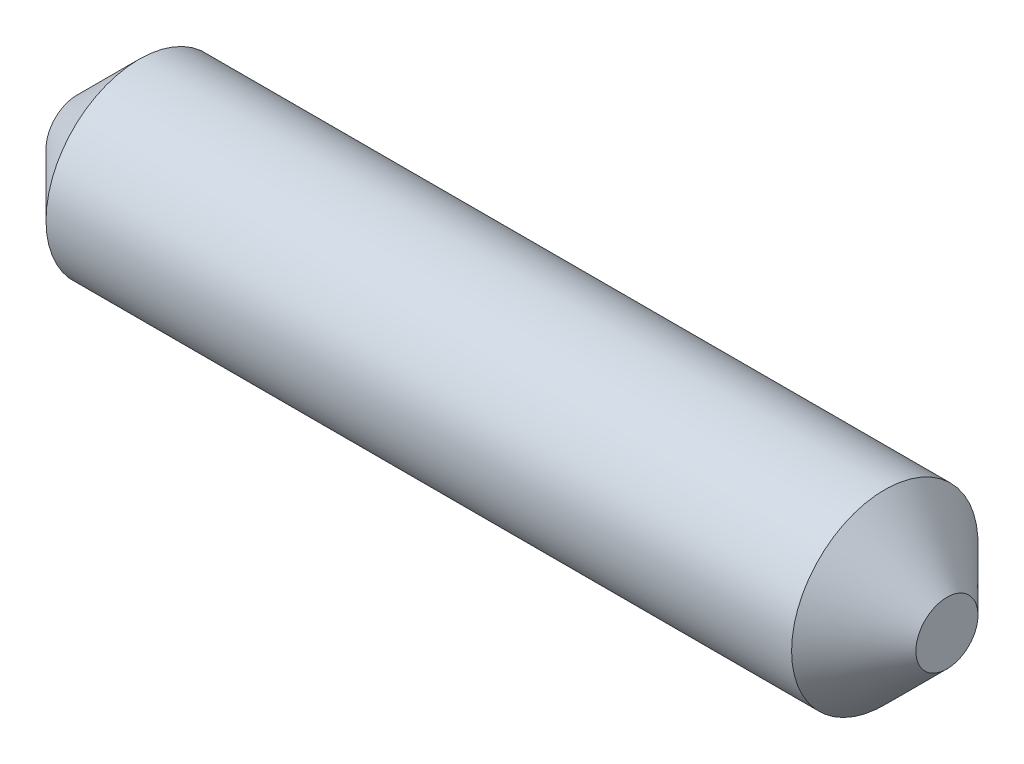
ISO-10303-21;
HEADER;
FILE_DESCRIPTION(('STEP AP214'),'2;1');
FILE_NAME('part.step','',(''),(''),'','','');
FILE_SCHEMA(('AUTOMOTIVE_DESIGN { 1 0 10303 214 1 1 1 1 }'));
ENDSEC;
DATA;
#1=APPLICATION_CONTEXT('core data for automotive mechanical design processes');
#2=APPLICATION_PROTOCOL_DEFINITION('international standard','automotive_design',2000,#1);
#3=PRODUCT_CONTEXT('',#1,'mechanical');
#4=PRODUCT('Part','Part','',(#3));
#5=PRODUCT_RELATED_PRODUCT_CATEGORY('part','',(#4));
#6=PRODUCT_DEFINITION_FORMATION('','',#4);
#7=PRODUCT_DEFINITION_CONTEXT('part definition',#1,'design');
#8=PRODUCT_DEFINITION('design','',#6,#7);
#9=PRODUCT_DEFINITION_SHAPE('','',#8);
#10=(LENGTH_UNIT() NAMED_UNIT(*) SI_UNIT(.MILLI.,.METRE.));
#11=(NAMED_UNIT(*) PLANE_ANGLE_UNIT() SI_UNIT($,.RADIAN.));
#12=(NAMED_UNIT(*) SI_UNIT($,.STERADIAN.) SOLID_ANGLE_UNIT());
#13=UNCERTAINTY_MEASURE_WITH_UNIT(LENGTH_MEASURE(1.E-05),#10,'distance_accuracy_value','');
#14=(GEOMETRIC_REPRESENTATION_CONTEXT(3) GLOBAL_UNCERTAINTY_ASSIGNED_CONTEXT((#13)) GLOBAL_UNIT_ASSIGNED_CONTEXT((#10,
#11,#12)) REPRESENTATION_CONTEXT('',''));
#15=CARTESIAN_POINT('',(0.,0.,0.));
#16=DIRECTION('',(0.,0.,1.));
#17=DIRECTION('',(1.,0.,0.));
#18=AXIS2_PLACEMENT_3D('',#15,#16,#17);
#19=CARTESIAN_POINT('',(7.,0.,0.));
#20=DIRECTION('',(-1.,0.,0.));
#21=DIRECTION('',(0.,0.,1.));
#22=AXIS2_PLACEMENT_3D('',#19,#20,#21);
#23=CYLINDRICAL_SURFACE('',#22,1.5);
#24=CARTESIAN_POINT('',(-6.,0.,0.));
#25=DIRECTION('',(1.,0.,0.));
#26=DIRECTION('',(0.,0.,-1.));
#27=AXIS2_PLACEMENT_3D('',#24,#25,#26);
#28=CIRCLE('',#27,1.5);
#29=CARTESIAN_POINT('',(-6.00000000000001,0.,-1.5));
#30=VERTEX_POINT('',#29);
#31=EDGE_CURVE('E42',#30,#30,#28,.T.);
#32=ORIENTED_EDGE('',*,*,#31,.T.);
#33=EDGE_LOOP('',(#32));
#34=FACE_BOUND('',#33,.T.);
#35=CARTESIAN_POINT('',(5.99999999999999,0.,0.));
#36=DIRECTION('',(1.,0.,0.));
#37=DIRECTION('',(0.,0.,-1.));
#38=AXIS2_PLACEMENT_3D('',#35,#36,#37);
#39=CIRCLE('',#38,1.5);
#40=CARTESIAN_POINT('',(5.99999999999999,0.,1.5));
#41=VERTEX_POINT('',#40);
#42=EDGE_CURVE('E46',#41,#41,#39,.F.);
#43=ORIENTED_EDGE('',*,*,#42,.T.);
#44=EDGE_LOOP('',(#43));
#45=FACE_BOUND('',#44,.T.);
#46=ADVANCED_FACE('F31',(#34,#45),#23,.T.);
#47=CARTESIAN_POINT('',(7.,0.,0.));
#48=DIRECTION('',(1.,0.,0.));
#49=DIRECTION('',(0.,0.,-1.));
#50=AXIS2_PLACEMENT_3D('',#47,#48,#49);
#51=PLANE('',#50);
#52=CARTESIAN_POINT('',(7.,0.,0.));
#53=DIRECTION('',(1.,0.,0.));
#54=DIRECTION('',(0.,0.,-1.));
#55=AXIS2_PLACEMENT_3D('',#52,#53,#54);
#56=CIRCLE('',#55,0.499999999999997);
#57=CARTESIAN_POINT('',(7.,0.,0.499999999999997));
#58=VERTEX_POINT('',#57);
#59=EDGE_CURVE('E10',#58,#58,#56,.T.);
#60=ORIENTED_EDGE('',*,*,#59,.T.);
#61=EDGE_LOOP('',(#60));
#62=FACE_BOUND('',#61,.T.);
#63=ADVANCED_FACE('F62',(#62),#51,.T.);
#64=CARTESIAN_POINT('',(-7.,0.,0.));
#65=DIRECTION('',(1.,0.,0.));
#66=DIRECTION('',(0.,0.,-1.));
#67=AXIS2_PLACEMENT_3D('',#64,#65,#66);
#68=PLANE('',#67);
#69=CARTESIAN_POINT('',(-7.,0.,0.));
#70=DIRECTION('',(1.,0.,0.));
#71=DIRECTION('',(0.,0.,-1.));
#72=AXIS2_PLACEMENT_3D('',#69,#70,#71);
#73=CIRCLE('',#72,0.5);
#74=CARTESIAN_POINT('',(-7.,0.,-0.5));
#75=VERTEX_POINT('',#74);
#76=EDGE_CURVE('E38',#75,#75,#73,.F.);
#77=ORIENTED_EDGE('',*,*,#76,.T.);
#78=EDGE_LOOP('',(#77));
#79=FACE_BOUND('',#78,.T.);
#80=ADVANCED_FACE('F59',(#79),#68,.F.);
#81=CARTESIAN_POINT('',(-6.,0.,0.));
#82=DIRECTION('',(1.,0.,0.));
#83=DIRECTION('',(0.,0.,-1.));
#84=AXIS2_PLACEMENT_3D('',#81,#82,#83);
#85=CONICAL_SURFACE('',#84,1.5,0.78539816339745);
#86=CARTESIAN_POINT('',(-7.,0.,-0.5));
#87=CARTESIAN_POINT('',(-6.98958333333333,0.,-0.510416666666667));
#88=CARTESIAN_POINT('',(-6.97916666666667,0.,-0.520833333333333));
#89=CARTESIAN_POINT('',(-6.95833333333333,0.,-0.541666666666667));
#90=CARTESIAN_POINT('',(-6.94791666666667,0.,-0.552083333333333));
#91=CARTESIAN_POINT('',(-6.92708333333333,0.,-0.572916666666667));
#92=CARTESIAN_POINT('',(-6.91666666666667,0.,-0.583333333333333));
#93=CARTESIAN_POINT('',(-6.89583333333333,0.,-0.604166666666667));
#94=CARTESIAN_POINT('',(-6.88541666666667,0.,-0.614583333333333));
#95=CARTESIAN_POINT('',(-6.86458333333333,0.,-0.635416666666666));
#96=CARTESIAN_POINT('',(-6.85416666666667,0.,-0.645833333333333));
#97=CARTESIAN_POINT('',(-6.83333333333333,0.,-0.666666666666666));
#98=CARTESIAN_POINT('',(-6.82291666666667,0.,-0.677083333333333));
#99=CARTESIAN_POINT('',(-6.80208333333334,0.,-0.697916666666667));
#100=CARTESIAN_POINT('',(-6.79166666666667,0.,-0.708333333333333));
#101=CARTESIAN_POINT('',(-6.77083333333334,0.,-0.729166666666666));
#102=CARTESIAN_POINT('',(-6.76041666666667,0.,-0.739583333333333));
#103=CARTESIAN_POINT('',(-6.73958333333334,0.,-0.760416666666666));
#104=CARTESIAN_POINT('',(-6.72916666666667,0.,-0.770833333333333));
#105=CARTESIAN_POINT('',(-6.70833333333333,0.,-0.791666666666666));
#106=CARTESIAN_POINT('',(-6.69791666666667,0.,-0.802083333333333));
#107=CARTESIAN_POINT('',(-6.67708333333333,0.,-0.822916666666666));
#108=CARTESIAN_POINT('',(-6.66666666666667,0.,-0.833333333333333));
#109=CARTESIAN_POINT('',(-6.64583333333334,0.,-0.854166666666667));
#110=CARTESIAN_POINT('',(-6.63541666666667,0.,-0.864583333333333));
#111=CARTESIAN_POINT('',(-6.61458333333334,0.,-0.885416666666666));
#112=CARTESIAN_POINT('',(-6.60416666666667,0.,-0.895833333333333));
#113=CARTESIAN_POINT('',(-6.58333333333334,0.,-0.916666666666666));
#114=CARTESIAN_POINT('',(-6.57291666666667,0.,-0.927083333333333));
#115=CARTESIAN_POINT('',(-6.55208333333334,0.,-0.947916666666666));
#116=CARTESIAN_POINT('',(-6.54166666666667,0.,-0.958333333333333));
#117=CARTESIAN_POINT('',(-6.52083333333334,0.,-0.979166666666666));
#118=CARTESIAN_POINT('',(-6.51041666666667,0.,-0.989583333333333));
#119=CARTESIAN_POINT('',(-6.48958333333334,0.,-1.01041666666667));
#120=CARTESIAN_POINT('',(-6.47916666666667,0.,-1.02083333333333));
#121=CARTESIAN_POINT('',(-6.45833333333334,0.,-1.04166666666667));
#122=CARTESIAN_POINT('',(-6.44791666666667,0.,-1.05208333333333));
#123=CARTESIAN_POINT('',(-6.42708333333334,0.,-1.07291666666667));
#124=CARTESIAN_POINT('',(-6.41666666666667,0.,-1.08333333333333));
#125=CARTESIAN_POINT('',(-6.39583333333334,0.,-1.10416666666667));
#126=CARTESIAN_POINT('',(-6.38541666666667,0.,-1.11458333333333));
#127=CARTESIAN_POINT('',(-6.36458333333334,0.,-1.13541666666667));
#128=CARTESIAN_POINT('',(-6.35416666666667,0.,-1.14583333333333));
#129=CARTESIAN_POINT('',(-6.33333333333334,0.,-1.16666666666667));
#130=CARTESIAN_POINT('',(-6.32291666666667,0.,-1.17708333333333));
#131=CARTESIAN_POINT('',(-6.30208333333334,0.,-1.19791666666667));
#132=CARTESIAN_POINT('',(-6.29166666666667,0.,-1.20833333333333));
#133=CARTESIAN_POINT('',(-6.27083333333334,0.,-1.22916666666667));
#134=CARTESIAN_POINT('',(-6.26041666666667,0.,-1.23958333333333));
#135=CARTESIAN_POINT('',(-6.23958333333334,0.,-1.26041666666667));
#136=CARTESIAN_POINT('',(-6.22916666666667,0.,-1.27083333333333));
#137=CARTESIAN_POINT('',(-6.20833333333334,0.,-1.29166666666667));
#138=CARTESIAN_POINT('',(-6.19791666666667,0.,-1.30208333333333));
#139=CARTESIAN_POINT('',(-6.17708333333334,0.,-1.32291666666667));
#140=CARTESIAN_POINT('',(-6.16666666666667,0.,-1.33333333333333));
#141=CARTESIAN_POINT('',(-6.14583333333334,0.,-1.35416666666667));
#142=CARTESIAN_POINT('',(-6.13541666666667,0.,-1.36458333333333));
#143=CARTESIAN_POINT('',(-6.11458333333334,0.,-1.38541666666667));
#144=CARTESIAN_POINT('',(-6.10416666666667,0.,-1.39583333333333));
#145=CARTESIAN_POINT('',(-6.08333333333334,0.,-1.41666666666667));
#146=CARTESIAN_POINT('',(-6.07291666666667,0.,-1.42708333333333));
#147=CARTESIAN_POINT('',(-6.05208333333334,0.,-1.44791666666667));
#148=CARTESIAN_POINT('',(-6.04166666666667,0.,-1.45833333333333));
#149=CARTESIAN_POINT('',(-6.02083333333334,0.,-1.47916666666667));
#150=CARTESIAN_POINT('',(-6.01041666666667,0.,-1.48958333333333));
#151=CARTESIAN_POINT('',(-6.00000000000001,0.,-1.5));
#152=B_SPLINE_CURVE_WITH_KNOTS('',3,(#86,#87,#88,#89,#90,#91,#92,#93,#94,#95,#96,#97,#98,#99,
#100,#101,#102,#103,#104,#105,#106,#107,#108,#109,#110,#111,#112,#113,#114,#115,#116,#117,#118,
#119,#120,#121,#122,#123,#124,#125,#126,#127,#128,#129,#130,#131,#132,#133,#134,#135,#136,#137,
#138,#139,#140,#141,#142,#143,#144,#145,#146,#147,#148,#149,#150,#151),.UNSPECIFIED.,.F.,.F.,(4,
2,2,2,2,2,2,2,2,2,2,2,2,2,2,2,2,2,2,2,2,2,2,2,2,2,2,2,2,2,2,2,4),(0.,0.0441941738241591,
0.0883883476483184,0.132582521472478,0.176776695296637,0.220970869120796,0.265165042944955,
0.309359216769114,0.353553390593273,0.397747564417432,0.441941738241591,0.48613591206575,
0.530330085889909,0.574524259714069,0.618718433538228,0.662912607362387,0.707106781186546,
0.751300955010705,0.795495128834864,0.839689302659023,0.883883476483183,0.928077650307341,
0.9722718241315,1.01646599795566,1.06066017177982,1.10485434560398,1.14904851942814,
1.1932426932523,1.23743686707646,1.28163104090061,1.32582521472477,1.37001938854893,
1.41421356237309),.UNSPECIFIED.);
#153=EDGE_CURVE('BSEAM55',#75,#30,#152,.T.);
#154=ORIENTED_EDGE('',*,*,#76,.F.);
#155=ORIENTED_EDGE('',*,*,#31,.F.);
#156=ORIENTED_EDGE('',*,*,#153,.T.);
#157=ORIENTED_EDGE('',*,*,#153,.F.);
#158=EDGE_LOOP('',(#154,#156,#155,#157));
#159=FACE_BOUND('',#158,.T.);
#160=ADVANCED_FACE('F55',(#159),#85,.T.);
#161=CARTESIAN_POINT('',(7.,0.,0.));
#162=DIRECTION('',(-1.,0.,0.));
#163=DIRECTION('',(0.,0.,1.));
#164=AXIS2_PLACEMENT_3D('',#161,#162,#163);
#165=CONICAL_SURFACE('',#164,0.499999999999997,0.785398163397447);
#166=CARTESIAN_POINT('',(5.99999999999999,0.,1.5));
#167=CARTESIAN_POINT('',(6.01041666666666,0.,1.48958333333333));
#168=CARTESIAN_POINT('',(6.02083333333333,0.,1.47916666666667));
#169=CARTESIAN_POINT('',(6.04166666666666,0.,1.45833333333333));
#170=CARTESIAN_POINT('',(6.05208333333333,0.,1.44791666666667));
#171=CARTESIAN_POINT('',(6.07291666666666,0.,1.42708333333333));
#172=CARTESIAN_POINT('',(6.08333333333333,0.,1.41666666666667));
#173=CARTESIAN_POINT('',(6.10416666666666,0.,1.39583333333333));
#174=CARTESIAN_POINT('',(6.11458333333333,0.,1.38541666666667));
#175=CARTESIAN_POINT('',(6.13541666666666,0.,1.36458333333333));
#176=CARTESIAN_POINT('',(6.14583333333333,0.,1.35416666666667));
#177=CARTESIAN_POINT('',(6.16666666666666,0.,1.33333333333333));
#178=CARTESIAN_POINT('',(6.17708333333333,0.,1.32291666666667));
#179=CARTESIAN_POINT('',(6.19791666666666,0.,1.30208333333333));
#180=CARTESIAN_POINT('',(6.20833333333333,0.,1.29166666666667));
#181=CARTESIAN_POINT('',(6.22916666666666,0.,1.27083333333333));
#182=CARTESIAN_POINT('',(6.23958333333333,0.,1.26041666666667));
#183=CARTESIAN_POINT('',(6.26041666666666,0.,1.23958333333333));
#184=CARTESIAN_POINT('',(6.27083333333333,0.,1.22916666666667));
#185=CARTESIAN_POINT('',(6.29166666666666,0.,1.20833333333333));
#186=CARTESIAN_POINT('',(6.30208333333333,0.,1.19791666666667));
#187=CARTESIAN_POINT('',(6.32291666666666,0.,1.17708333333333));
#188=CARTESIAN_POINT('',(6.33333333333333,0.,1.16666666666667));
#189=CARTESIAN_POINT('',(6.35416666666666,0.,1.14583333333333));
#190=CARTESIAN_POINT('',(6.36458333333333,0.,1.13541666666667));
#191=CARTESIAN_POINT('',(6.38541666666666,0.,1.11458333333333));
#192=CARTESIAN_POINT('',(6.39583333333333,0.,1.10416666666667));
#193=CARTESIAN_POINT('',(6.41666666666666,0.,1.08333333333333));
#194=CARTESIAN_POINT('',(6.42708333333333,0.,1.07291666666667));
#195=CARTESIAN_POINT('',(6.44791666666666,0.,1.05208333333333));
#196=CARTESIAN_POINT('',(6.45833333333333,0.,1.04166666666667));
#197=CARTESIAN_POINT('',(6.47916666666666,0.,1.02083333333333));
#198=CARTESIAN_POINT('',(6.48958333333333,0.,1.01041666666667));
#199=CARTESIAN_POINT('',(6.51041666666666,0.,0.989583333333332));
#200=CARTESIAN_POINT('',(6.52083333333333,0.,0.979166666666665));
#201=CARTESIAN_POINT('',(6.54166666666666,0.,0.958333333333332));
#202=CARTESIAN_POINT('',(6.55208333333333,0.,0.947916666666665));
#203=CARTESIAN_POINT('',(6.57291666666666,0.,0.927083333333332));
#204=CARTESIAN_POINT('',(6.58333333333333,0.,0.916666666666665));
#205=CARTESIAN_POINT('',(6.60416666666666,0.,0.895833333333332));
#206=CARTESIAN_POINT('',(6.61458333333333,0.,0.885416666666665));
#207=CARTESIAN_POINT('',(6.63541666666666,0.,0.864583333333332));
#208=CARTESIAN_POINT('',(6.64583333333333,0.,0.854166666666665));
#209=CARTESIAN_POINT('',(6.66666666666666,0.,0.833333333333332));
#210=CARTESIAN_POINT('',(6.67708333333333,0.,0.822916666666665));
#211=CARTESIAN_POINT('',(6.69791666666666,0.,0.802083333333332));
#212=CARTESIAN_POINT('',(6.70833333333333,0.,0.791666666666665));
#213=CARTESIAN_POINT('',(6.72916666666666,0.,0.770833333333331));
#214=CARTESIAN_POINT('',(6.73958333333333,0.,0.760416666666665));
#215=CARTESIAN_POINT('',(6.76041666666666,0.,0.739583333333331));
#216=CARTESIAN_POINT('',(6.77083333333333,0.,0.729166666666665));
#217=CARTESIAN_POINT('',(6.79166666666666,0.,0.708333333333331));
#218=CARTESIAN_POINT('',(6.80208333333333,0.,0.697916666666665));
#219=CARTESIAN_POINT('',(6.82291666666667,0.,0.677083333333331));
#220=CARTESIAN_POINT('',(6.83333333333333,0.,0.666666666666665));
#221=CARTESIAN_POINT('',(6.85416666666667,0.,0.645833333333331));
#222=CARTESIAN_POINT('',(6.86458333333333,0.,0.635416666666664));
#223=CARTESIAN_POINT('',(6.88541666666667,0.,0.614583333333331));
#224=CARTESIAN_POINT('',(6.89583333333333,0.,0.604166666666664));
#225=CARTESIAN_POINT('',(6.91666666666667,0.,0.583333333333331));
#226=CARTESIAN_POINT('',(6.92708333333333,0.,0.572916666666664));
#227=CARTESIAN_POINT('',(6.94791666666667,0.,0.552083333333331));
#228=CARTESIAN_POINT('',(6.95833333333333,0.,0.541666666666664));
#229=CARTESIAN_POINT('',(6.97916666666667,0.,0.520833333333331));
#230=CARTESIAN_POINT('',(6.98958333333333,0.,0.510416666666664));
#231=CARTESIAN_POINT('',(7.,0.,0.499999999999997));
#232=B_SPLINE_CURVE_WITH_KNOTS('',3,(#166,#167,#168,#169,#170,#171,#172,#173,#174,#175,#176,
#177,#178,#179,#180,#181,#182,#183,#184,#185,#186,#187,#188,#189,#190,#191,#192,#193,#194,#195,
#196,#197,#198,#199,#200,#201,#202,#203,#204,#205,#206,#207,#208,#209,#210,#211,#212,#213,#214,
#215,#216,#217,#218,#219,#220,#221,#222,#223,#224,#225,#226,#227,#228,#229,#230,#231),
.UNSPECIFIED.,.F.,.F.,(4,2,2,2,2,2,2,2,2,2,2,2,2,2,2,2,2,2,2,2,2,2,2,2,2,2,2,2,2,2,2,2,4),(0.,
0.0441941738241599,0.0883883476483191,0.132582521472478,0.176776695296638,0.220970869120798,
0.265165042944957,0.309359216769116,0.353553390593276,0.397747564417435,0.441941738241594,
0.486135912065754,0.530330085889913,0.574524259714073,0.618718433538232,0.662912607362391,
0.707106781186551,0.751300955010711,0.79549512883487,0.839689302659029,0.883883476483188,
0.928077650307348,0.972271824131508,1.01646599795567,1.06066017177983,1.10485434560399,
1.14904851942814,1.1932426932523,1.23743686707646,1.28163104090062,1.32582521472478,
1.37001938854894,1.4142135623731),.UNSPECIFIED.);
#233=EDGE_CURVE('BSEAM33',#41,#58,#232,.T.);
#234=ORIENTED_EDGE('',*,*,#42,.F.);
#235=ORIENTED_EDGE('',*,*,#59,.F.);
#236=ORIENTED_EDGE('',*,*,#233,.T.);
#237=ORIENTED_EDGE('',*,*,#233,.F.);
#238=EDGE_LOOP('',(#234,#236,#235,#237));
#239=FACE_BOUND('',#238,.T.);
#240=ADVANCED_FACE('F33',(#239),#165,.T.);
#241=CLOSED_SHELL('',(#46,#63,#80,#160,#240));
#242=MANIFOLD_SOLID_BREP('B2',#241);
#243=ADVANCED_BREP_SHAPE_REPRESENTATION('',(#18,#242),#14);
#244=SHAPE_DEFINITION_REPRESENTATION(#9,#243);
ENDSEC;
END-ISO-10303-21;
